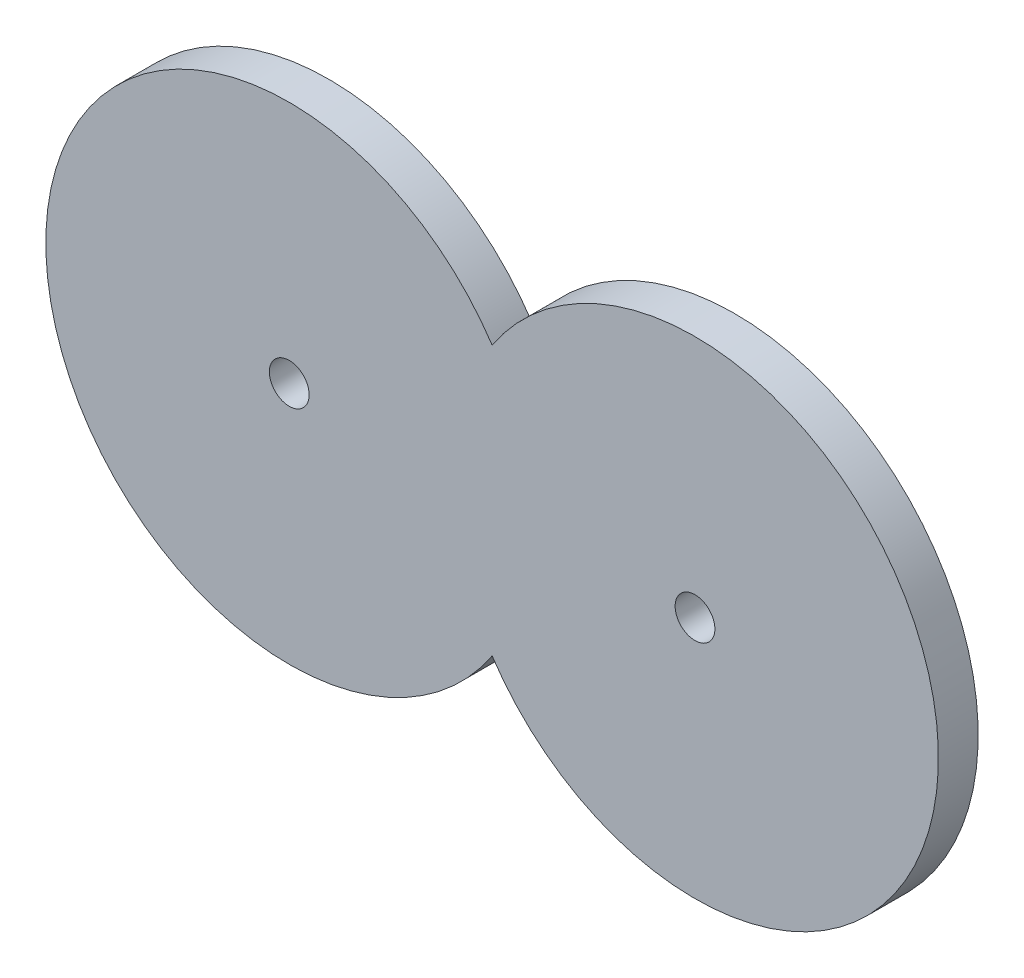
ISO-10303-21;
HEADER;
FILE_DESCRIPTION(('STEP AP214'),'2;1');
FILE_NAME('part.step','',(''),(''),'','','');
FILE_SCHEMA(('AUTOMOTIVE_DESIGN { 1 0 10303 214 1 1 1 1 }'));
ENDSEC;
DATA;
#1=APPLICATION_CONTEXT('core data for automotive mechanical design processes');
#2=APPLICATION_PROTOCOL_DEFINITION('international standard','automotive_design',2000,#1);
#3=PRODUCT_CONTEXT('',#1,'mechanical');
#4=PRODUCT('Part','Part','',(#3));
#5=PRODUCT_RELATED_PRODUCT_CATEGORY('part','',(#4));
#6=PRODUCT_DEFINITION_FORMATION('','',#4);
#7=PRODUCT_DEFINITION_CONTEXT('part definition',#1,'design');
#8=PRODUCT_DEFINITION('design','',#6,#7);
#9=PRODUCT_DEFINITION_SHAPE('','',#8);
#10=(LENGTH_UNIT() NAMED_UNIT(*) SI_UNIT(.MILLI.,.METRE.));
#11=(NAMED_UNIT(*) PLANE_ANGLE_UNIT() SI_UNIT($,.RADIAN.));
#12=(NAMED_UNIT(*) SI_UNIT($,.STERADIAN.) SOLID_ANGLE_UNIT());
#13=UNCERTAINTY_MEASURE_WITH_UNIT(LENGTH_MEASURE(1.E-05),#10,'distance_accuracy_value','');
#14=(GEOMETRIC_REPRESENTATION_CONTEXT(3) GLOBAL_UNCERTAINTY_ASSIGNED_CONTEXT((#13)) GLOBAL_UNIT_ASSIGNED_CONTEXT((#10,
#11,#12)) REPRESENTATION_CONTEXT('',''));
#15=CARTESIAN_POINT('',(0.,0.,0.));
#16=DIRECTION('',(0.,0.,1.));
#17=DIRECTION('',(1.,0.,0.));
#18=AXIS2_PLACEMENT_3D('',#15,#16,#17);
#19=CARTESIAN_POINT('',(63.5,19.05,6.223));
#20=DIRECTION('',(0.,0.,-1.));
#21=DIRECTION('',(-1.,0.,0.));
#22=AXIS2_PLACEMENT_3D('',#19,#20,#21);
#23=CYLINDRICAL_SURFACE('',#22,38.1);
#24=CARTESIAN_POINT('',(63.5,19.05,0.));
#25=DIRECTION('',(0.,0.,1.));
#26=DIRECTION('',(1.,0.,0.));
#27=AXIS2_PLACEMENT_3D('',#24,#25,#26);
#28=CIRCLE('',#27,38.1);
#29=CARTESIAN_POINT('',(31.75,-2.01056741875679,0.));
#30=VERTEX_POINT('',#29);
#31=CARTESIAN_POINT('',(31.75,40.1105674187568,0.));
#32=VERTEX_POINT('',#31);
#33=EDGE_CURVE('E75',#30,#32,#28,.T.);
#34=ORIENTED_EDGE('',*,*,#33,.T.);
#35=DIRECTION('',(0.,0.,-1.));
#36=VECTOR('',#35,1.);
#37=CARTESIAN_POINT('',(31.75,40.1105674187568,6.223));
#38=LINE('',#37,#36);
#39=CARTESIAN_POINT('',(31.75,40.1105674187568,6.223));
#40=VERTEX_POINT('',#39);
#41=EDGE_CURVE('E11',#40,#32,#38,.T.);
#42=ORIENTED_EDGE('',*,*,#41,.F.);
#43=CARTESIAN_POINT('',(63.5,19.05,6.223));
#44=DIRECTION('',(0.,0.,1.));
#45=DIRECTION('',(1.,0.,0.));
#46=AXIS2_PLACEMENT_3D('',#43,#44,#45);
#47=CIRCLE('',#46,38.1);
#48=CARTESIAN_POINT('',(31.75,-2.01056741875679,6.223));
#49=VERTEX_POINT('',#48);
#50=EDGE_CURVE('E78',#49,#40,#47,.T.);
#51=ORIENTED_EDGE('',*,*,#50,.F.);
#52=DIRECTION('',(0.,0.,-1.));
#53=VECTOR('',#52,1.);
#54=CARTESIAN_POINT('',(31.75,-2.01056741875679,6.223));
#55=LINE('',#54,#53);
#56=EDGE_CURVE('E47',#49,#30,#55,.T.);
#57=ORIENTED_EDGE('',*,*,#56,.T.);
#58=EDGE_LOOP('',(#34,#42,#51,#57));
#59=FACE_BOUND('',#58,.T.);
#60=ADVANCED_FACE('F37',(#59),#23,.T.);
#61=CARTESIAN_POINT('',(0.,19.05,6.223));
#62=DIRECTION('',(0.,0.,-1.));
#63=DIRECTION('',(-1.,0.,0.));
#64=AXIS2_PLACEMENT_3D('',#61,#62,#63);
#65=CYLINDRICAL_SURFACE('',#64,38.1);
#66=CARTESIAN_POINT('',(0.,19.05,0.));
#67=DIRECTION('',(0.,0.,1.));
#68=DIRECTION('',(1.,0.,0.));
#69=AXIS2_PLACEMENT_3D('',#66,#67,#68);
#70=CIRCLE('',#69,38.1);
#71=EDGE_CURVE('E66',#32,#30,#70,.T.);
#72=ORIENTED_EDGE('',*,*,#71,.T.);
#73=ORIENTED_EDGE('',*,*,#56,.F.);
#74=CARTESIAN_POINT('',(0.,19.05,6.223));
#75=DIRECTION('',(0.,0.,1.));
#76=DIRECTION('',(1.,0.,0.));
#77=AXIS2_PLACEMENT_3D('',#74,#75,#76);
#78=CIRCLE('',#77,38.1);
#79=EDGE_CURVE('E57',#40,#49,#78,.T.);
#80=ORIENTED_EDGE('',*,*,#79,.F.);
#81=ORIENTED_EDGE('',*,*,#41,.T.);
#82=EDGE_LOOP('',(#72,#73,#80,#81));
#83=FACE_BOUND('',#82,.T.);
#84=ADVANCED_FACE('F69',(#83),#65,.T.);
#85=CARTESIAN_POINT('',(63.5,19.05,6.223));
#86=DIRECTION('',(0.,0.,-1.));
#87=DIRECTION('',(-1.,0.,0.));
#88=AXIS2_PLACEMENT_3D('',#85,#86,#87);
#89=CYLINDRICAL_SURFACE('',#88,3.1115);
#90=CARTESIAN_POINT('',(63.5,19.05,6.223));
#91=DIRECTION('',(0.,0.,1.));
#92=DIRECTION('',(1.,0.,0.));
#93=AXIS2_PLACEMENT_3D('',#90,#91,#92);
#94=CIRCLE('',#93,3.1115);
#95=CARTESIAN_POINT('',(66.6115,19.05,6.223));
#96=VERTEX_POINT('',#95);
#97=EDGE_CURVE('E93',#96,#96,#94,.T.);
#98=ORIENTED_EDGE('',*,*,#97,.T.);
#99=EDGE_LOOP('',(#98));
#100=FACE_BOUND('',#99,.T.);
#101=CARTESIAN_POINT('',(63.5,19.05,0.));
#102=DIRECTION('',(0.,0.,1.));
#103=DIRECTION('',(1.,0.,0.));
#104=AXIS2_PLACEMENT_3D('',#101,#102,#103);
#105=CIRCLE('',#104,3.1115);
#106=CARTESIAN_POINT('',(66.6115,19.05,0.));
#107=VERTEX_POINT('',#106);
#108=EDGE_CURVE('E84',#107,#107,#105,.T.);
#109=ORIENTED_EDGE('',*,*,#108,.F.);
#110=EDGE_LOOP('',(#109));
#111=FACE_BOUND('',#110,.T.);
#112=ADVANCED_FACE('F39',(#100,#111),#89,.F.);
#113=CARTESIAN_POINT('',(0.,19.05,6.223));
#114=DIRECTION('',(0.,0.,-1.));
#115=DIRECTION('',(-1.,0.,0.));
#116=AXIS2_PLACEMENT_3D('',#113,#114,#115);
#117=CYLINDRICAL_SURFACE('',#116,3.1115);
#118=CARTESIAN_POINT('',(0.,19.05,6.223));
#119=DIRECTION('',(0.,0.,1.));
#120=DIRECTION('',(1.,0.,0.));
#121=AXIS2_PLACEMENT_3D('',#118,#119,#120);
#122=CIRCLE('',#121,3.1115);
#123=CARTESIAN_POINT('',(3.1115,19.05,6.223));
#124=VERTEX_POINT('',#123);
#125=EDGE_CURVE('E80',#124,#124,#122,.T.);
#126=ORIENTED_EDGE('',*,*,#125,.T.);
#127=EDGE_LOOP('',(#126));
#128=FACE_BOUND('',#127,.T.);
#129=CARTESIAN_POINT('',(0.,19.05,0.));
#130=DIRECTION('',(0.,0.,1.));
#131=DIRECTION('',(1.,0.,0.));
#132=AXIS2_PLACEMENT_3D('',#129,#130,#131);
#133=CIRCLE('',#132,3.1115);
#134=CARTESIAN_POINT('',(3.1115,19.05,0.));
#135=VERTEX_POINT('',#134);
#136=EDGE_CURVE('E74',#135,#135,#133,.T.);
#137=ORIENTED_EDGE('',*,*,#136,.F.);
#138=EDGE_LOOP('',(#137));
#139=FACE_BOUND('',#138,.T.);
#140=ADVANCED_FACE('F108',(#128,#139),#117,.F.);
#141=CARTESIAN_POINT('',(31.75,-104.865936705723,6.223));
#142=DIRECTION('',(0.,0.,1.));
#143=DIRECTION('',(1.,0.,0.));
#144=AXIS2_PLACEMENT_3D('',#141,#142,#143);
#145=PLANE('',#144);
#146=ORIENTED_EDGE('',*,*,#97,.F.);
#147=EDGE_LOOP('',(#146));
#148=FACE_BOUND('',#147,.T.);
#149=ORIENTED_EDGE('',*,*,#50,.T.);
#150=ORIENTED_EDGE('',*,*,#79,.T.);
#151=EDGE_LOOP('',(#149,#150));
#152=FACE_BOUND('',#151,.T.);
#153=ORIENTED_EDGE('',*,*,#125,.F.);
#154=EDGE_LOOP('',(#153));
#155=FACE_BOUND('',#154,.T.);
#156=ADVANCED_FACE('F111',(#148,#152,#155),#145,.T.);
#157=CARTESIAN_POINT('',(31.75,-104.865936705723,0.));
#158=DIRECTION('',(0.,0.,1.));
#159=DIRECTION('',(1.,0.,0.));
#160=AXIS2_PLACEMENT_3D('',#157,#158,#159);
#161=PLANE('',#160);
#162=ORIENTED_EDGE('',*,*,#108,.T.);
#163=EDGE_LOOP('',(#162));
#164=FACE_BOUND('',#163,.T.);
#165=ORIENTED_EDGE('',*,*,#33,.F.);
#166=ORIENTED_EDGE('',*,*,#71,.F.);
#167=EDGE_LOOP('',(#165,#166));
#168=FACE_BOUND('',#167,.T.);
#169=ORIENTED_EDGE('',*,*,#136,.T.);
#170=EDGE_LOOP('',(#169));
#171=FACE_BOUND('',#170,.T.);
#172=ADVANCED_FACE('F81',(#164,#168,#171),#161,.F.);
#173=CLOSED_SHELL('',(#60,#84,#112,#140,#156,#172));
#174=MANIFOLD_SOLID_BREP('B2',#173);
#175=ADVANCED_BREP_SHAPE_REPRESENTATION('',(#18,#174),#14);
#176=SHAPE_DEFINITION_REPRESENTATION(#9,#175);
ENDSEC;
END-ISO-10303-21;
